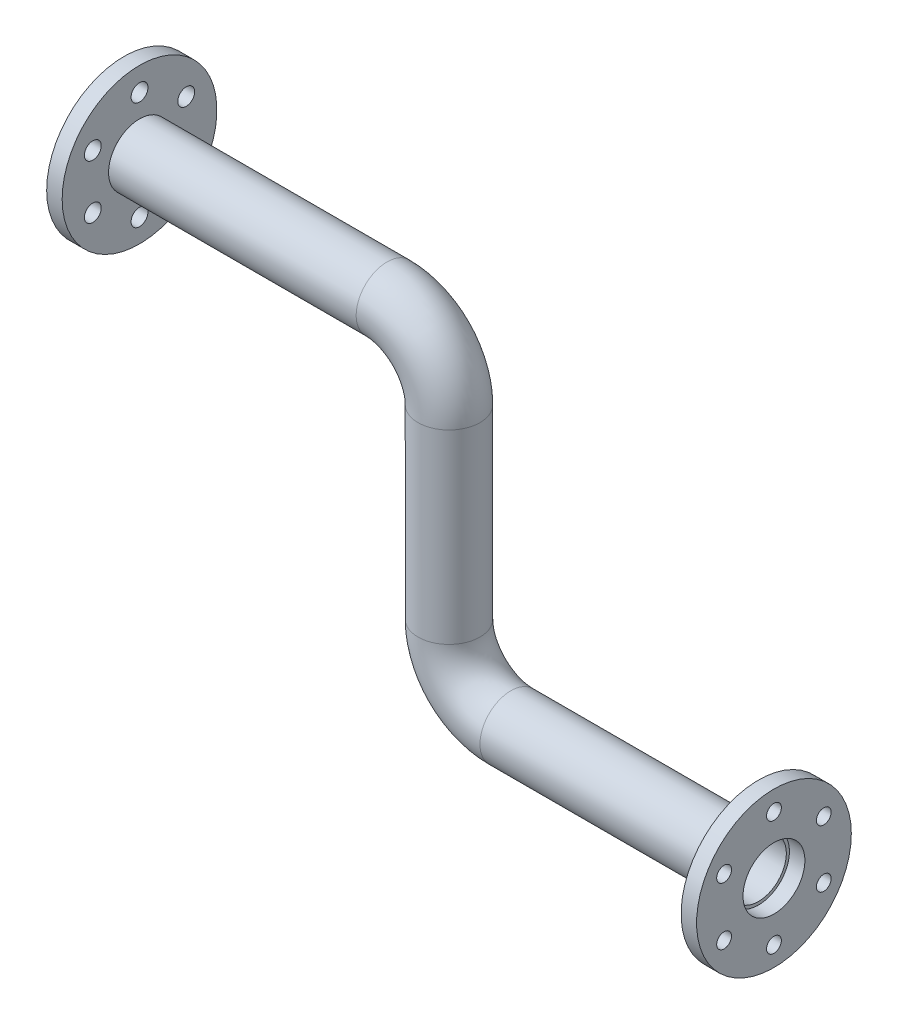
ISO-10303-21;
HEADER;
FILE_DESCRIPTION(('STEP AP214'),'2;1');
FILE_NAME('part.step','',(''),(''),'','','');
FILE_SCHEMA(('AUTOMOTIVE_DESIGN { 1 0 10303 214 1 1 1 1 }'));
ENDSEC;
DATA;
#1=APPLICATION_CONTEXT('core data for automotive mechanical design processes');
#2=APPLICATION_PROTOCOL_DEFINITION('international standard','automotive_design',2000,#1);
#3=PRODUCT_CONTEXT('',#1,'mechanical');
#4=PRODUCT('Part','Part','',(#3));
#5=PRODUCT_RELATED_PRODUCT_CATEGORY('part','',(#4));
#6=PRODUCT_DEFINITION_FORMATION('','',#4);
#7=PRODUCT_DEFINITION_CONTEXT('part definition',#1,'design');
#8=PRODUCT_DEFINITION('design','',#6,#7);
#9=PRODUCT_DEFINITION_SHAPE('','',#8);
#10=(LENGTH_UNIT() NAMED_UNIT(*) SI_UNIT(.MILLI.,.METRE.));
#11=(NAMED_UNIT(*) PLANE_ANGLE_UNIT() SI_UNIT($,.RADIAN.));
#12=(NAMED_UNIT(*) SI_UNIT($,.STERADIAN.) SOLID_ANGLE_UNIT());
#13=UNCERTAINTY_MEASURE_WITH_UNIT(LENGTH_MEASURE(1.E-05),#10,'distance_accuracy_value','');
#14=(GEOMETRIC_REPRESENTATION_CONTEXT(3) GLOBAL_UNCERTAINTY_ASSIGNED_CONTEXT((#13)) GLOBAL_UNIT_ASSIGNED_CONTEXT((#10,
#11,#12)) REPRESENTATION_CONTEXT('',''));
#15=CARTESIAN_POINT('',(0.,0.,0.));
#16=DIRECTION('',(0.,0.,1.));
#17=DIRECTION('',(1.,0.,0.));
#18=AXIS2_PLACEMENT_3D('',#15,#16,#17);
#19=CARTESIAN_POINT('',(205.,-100.000000000002,0.));
#20=DIRECTION('',(1.,0.,0.));
#21=DIRECTION('',(0.,0.,-1.));
#22=AXIS2_PLACEMENT_3D('',#19,#20,#21);
#23=PLANE('',#22);
#24=CARTESIAN_POINT('',(205.,-90.7015929837478,-16.105313381606));
#25=DIRECTION('',(1.,0.,0.));
#26=DIRECTION('',(0.,-0.866025403784433,-0.50000000000001));
#27=AXIS2_PLACEMENT_3D('',#24,#25,#26);
#28=CIRCLE('',#27,2.39409198799303);
#29=CARTESIAN_POINT('',(205.,-92.7749374643465,-17.3023593756026));
#30=VERTEX_POINT('',#29);
#31=EDGE_CURVE('E107',#30,#30,#28,.T.);
#32=ORIENTED_EDGE('',*,*,#31,.F.);
#33=EDGE_LOOP('',(#32));
#34=FACE_BOUND('',#33,.T.);
#35=CARTESIAN_POINT('',(205.,-109.298407016255,-16.1053133816062));
#36=DIRECTION('',(1.,0.,0.));
#37=DIRECTION('',(0.,-0.866025403784443,0.499999999999992));
#38=AXIS2_PLACEMENT_3D('',#35,#36,#37);
#39=CIRCLE('',#38,2.39409198799303);
#40=CARTESIAN_POINT('',(205.,-111.371751496854,-14.9082673876097));
#41=VERTEX_POINT('',#40);
#42=EDGE_CURVE('E106',#41,#41,#39,.T.);
#43=ORIENTED_EDGE('',*,*,#42,.F.);
#44=EDGE_LOOP('',(#43));
#45=FACE_BOUND('',#44,.T.);
#46=CARTESIAN_POINT('',(205.,-118.596814032509,0.));
#47=DIRECTION('',(1.,0.,0.));
#48=DIRECTION('',(0.,0.,1.));
#49=AXIS2_PLACEMENT_3D('',#46,#47,#48);
#50=CIRCLE('',#49,2.39409198799303);
#51=CARTESIAN_POINT('',(205.,-118.596814032509,2.39409198799303));
#52=VERTEX_POINT('',#51);
#53=EDGE_CURVE('E113',#52,#52,#50,.T.);
#54=ORIENTED_EDGE('',*,*,#53,.F.);
#55=EDGE_LOOP('',(#54));
#56=FACE_BOUND('',#55,.T.);
#57=CARTESIAN_POINT('',(205.,-109.298407016255,16.1053133816061));
#58=DIRECTION('',(1.,0.,0.));
#59=DIRECTION('',(0.,0.866025403784436,0.500000000000004));
#60=AXIS2_PLACEMENT_3D('',#57,#58,#59);
#61=CIRCLE('',#60,2.39409198799303);
#62=CARTESIAN_POINT('',(205.,-107.225062535656,17.3023593756026));
#63=VERTEX_POINT('',#62);
#64=EDGE_CURVE('E119',#63,#63,#61,.T.);
#65=ORIENTED_EDGE('',*,*,#64,.F.);
#66=EDGE_LOOP('',(#65));
#67=FACE_BOUND('',#66,.T.);
#68=CARTESIAN_POINT('',(205.,-90.701592983748,16.1053133816062));
#69=DIRECTION('',(1.,0.,0.));
#70=DIRECTION('',(0.,0.86602540378444,-0.499999999999998));
#71=AXIS2_PLACEMENT_3D('',#68,#69,#70);
#72=CIRCLE('',#71,2.39409198799303);
#73=CARTESIAN_POINT('',(205.,-88.6282485031492,14.9082673876096));
#74=VERTEX_POINT('',#73);
#75=EDGE_CURVE('E99',#74,#74,#72,.T.);
#76=ORIENTED_EDGE('',*,*,#75,.F.);
#77=EDGE_LOOP('',(#76));
#78=FACE_BOUND('',#77,.T.);
#79=CARTESIAN_POINT('',(205.,-81.4031859674944,0.));
#80=DIRECTION('',(1.,0.,0.));
#81=DIRECTION('',(0.,0.,-1.));
#82=AXIS2_PLACEMENT_3D('',#79,#80,#81);
#83=CIRCLE('',#82,2.39409198799303);
#84=CARTESIAN_POINT('',(205.,-81.4031859674944,-2.39409198799303));
#85=VERTEX_POINT('',#84);
#86=EDGE_CURVE('E93',#85,#85,#83,.T.);
#87=ORIENTED_EDGE('',*,*,#86,.F.);
#88=EDGE_LOOP('',(#87));
#89=FACE_BOUND('',#88,.T.);
#90=CARTESIAN_POINT('',(205.,-100.000000000002,0.));
#91=DIRECTION('',(1.,0.,0.));
#92=DIRECTION('',(0.,0.,-1.));
#93=AXIS2_PLACEMENT_3D('',#90,#91,#92);
#94=CIRCLE('',#93,25.);
#95=CARTESIAN_POINT('',(205.,-100.000000000002,-25.));
#96=VERTEX_POINT('',#95);
#97=EDGE_CURVE('E12',#96,#96,#94,.T.);
#98=ORIENTED_EDGE('',*,*,#97,.T.);
#99=EDGE_LOOP('',(#98));
#100=FACE_BOUND('',#99,.T.);
#101=CARTESIAN_POINT('',(205.,-100.,0.));
#102=DIRECTION('',(1.,0.,0.));
#103=DIRECTION('',(0.,0.,-1.));
#104=AXIS2_PLACEMENT_3D('',#101,#102,#103);
#105=CIRCLE('',#104,10.);
#106=CARTESIAN_POINT('',(205.,-100.,-10.));
#107=VERTEX_POINT('',#106);
#108=EDGE_CURVE('E83',#107,#107,#105,.T.);
#109=ORIENTED_EDGE('',*,*,#108,.F.);
#110=EDGE_LOOP('',(#109));
#111=FACE_BOUND('',#110,.T.);
#112=ADVANCED_FACE('F72',(#34,#45,#56,#67,#78,#89,#100,#111),#23,.T.);
#113=CARTESIAN_POINT('',(200.,-100.000000000002,0.));
#114=DIRECTION('',(1.,0.,0.));
#115=DIRECTION('',(0.,0.,-1.));
#116=AXIS2_PLACEMENT_3D('',#113,#114,#115);
#117=PLANE('',#116);
#118=CARTESIAN_POINT('',(200.,-90.7015929837478,-16.105313381606));
#119=DIRECTION('',(1.,0.,0.));
#120=DIRECTION('',(0.,0.,-1.));
#121=AXIS2_PLACEMENT_3D('',#118,#119,#120);
#122=CIRCLE('',#121,2.39409198799303);
#123=CARTESIAN_POINT('',(200.,-90.7015929837478,-18.4994053695991));
#124=VERTEX_POINT('',#123);
#125=EDGE_CURVE('E103',#124,#124,#122,.F.);
#126=ORIENTED_EDGE('',*,*,#125,.F.);
#127=EDGE_LOOP('',(#126));
#128=FACE_BOUND('',#127,.T.);
#129=CARTESIAN_POINT('',(200.,-109.298407016255,-16.1053133816062));
#130=DIRECTION('',(1.,0.,0.));
#131=DIRECTION('',(0.,0.,-1.));
#132=AXIS2_PLACEMENT_3D('',#129,#130,#131);
#133=CIRCLE('',#132,2.39409198799303);
#134=CARTESIAN_POINT('',(200.,-109.298407016255,-18.4994053695993));
#135=VERTEX_POINT('',#134);
#136=EDGE_CURVE('E110',#135,#135,#133,.F.);
#137=ORIENTED_EDGE('',*,*,#136,.F.);
#138=EDGE_LOOP('',(#137));
#139=FACE_BOUND('',#138,.T.);
#140=CARTESIAN_POINT('',(200.,-118.596814032509,0.));
#141=DIRECTION('',(1.,0.,0.));
#142=DIRECTION('',(0.,0.,-1.));
#143=AXIS2_PLACEMENT_3D('',#140,#141,#142);
#144=CIRCLE('',#143,2.39409198799303);
#145=CARTESIAN_POINT('',(200.,-118.596814032509,-2.39409198799303));
#146=VERTEX_POINT('',#145);
#147=EDGE_CURVE('E116',#146,#146,#144,.F.);
#148=ORIENTED_EDGE('',*,*,#147,.F.);
#149=EDGE_LOOP('',(#148));
#150=FACE_BOUND('',#149,.T.);
#151=CARTESIAN_POINT('',(200.,-109.298407016255,16.1053133816061));
#152=DIRECTION('',(1.,0.,0.));
#153=DIRECTION('',(0.,0.,-1.));
#154=AXIS2_PLACEMENT_3D('',#151,#152,#153);
#155=CIRCLE('',#154,2.39409198799303);
#156=CARTESIAN_POINT('',(200.,-109.298407016255,13.7112213936131));
#157=VERTEX_POINT('',#156);
#158=EDGE_CURVE('E102',#157,#157,#155,.F.);
#159=ORIENTED_EDGE('',*,*,#158,.F.);
#160=EDGE_LOOP('',(#159));
#161=FACE_BOUND('',#160,.T.);
#162=CARTESIAN_POINT('',(200.,-90.701592983748,16.1053133816062));
#163=DIRECTION('',(1.,0.,0.));
#164=DIRECTION('',(0.,0.,-1.));
#165=AXIS2_PLACEMENT_3D('',#162,#163,#164);
#166=CIRCLE('',#165,2.39409198799303);
#167=CARTESIAN_POINT('',(200.,-90.701592983748,13.7112213936131));
#168=VERTEX_POINT('',#167);
#169=EDGE_CURVE('E96',#168,#168,#166,.F.);
#170=ORIENTED_EDGE('',*,*,#169,.F.);
#171=EDGE_LOOP('',(#170));
#172=FACE_BOUND('',#171,.T.);
#173=CARTESIAN_POINT('',(200.,-81.4031859674944,0.));
#174=DIRECTION('',(1.,0.,0.));
#175=DIRECTION('',(0.,0.,-1.));
#176=AXIS2_PLACEMENT_3D('',#173,#174,#175);
#177=CIRCLE('',#176,2.39409198799303);
#178=CARTESIAN_POINT('',(200.,-81.4031859674944,-2.39409198799303));
#179=VERTEX_POINT('',#178);
#180=EDGE_CURVE('E88',#179,#179,#177,.F.);
#181=ORIENTED_EDGE('',*,*,#180,.F.);
#182=EDGE_LOOP('',(#181));
#183=FACE_BOUND('',#182,.T.);
#184=CARTESIAN_POINT('',(200.,-100.000000000002,0.));
#185=DIRECTION('',(1.,0.,0.));
#186=DIRECTION('',(0.,0.,-1.));
#187=AXIS2_PLACEMENT_3D('',#184,#185,#186);
#188=CIRCLE('',#187,25.);
#189=CARTESIAN_POINT('',(200.,-100.000000000002,-25.));
#190=VERTEX_POINT('',#189);
#191=EDGE_CURVE('E76',#190,#190,#188,.T.);
#192=ORIENTED_EDGE('',*,*,#191,.F.);
#193=EDGE_LOOP('',(#192));
#194=FACE_BOUND('',#193,.T.);
#195=CARTESIAN_POINT('',(200.,-100.,0.));
#196=DIRECTION('',(1.,0.,0.));
#197=DIRECTION('',(0.,0.,-1.));
#198=AXIS2_PLACEMENT_3D('',#195,#196,#197);
#199=CIRCLE('',#198,10.);
#200=CARTESIAN_POINT('',(200.,-100.,-10.));
#201=VERTEX_POINT('',#200);
#202=EDGE_CURVE('E85',#201,#201,#199,.T.);
#203=ORIENTED_EDGE('',*,*,#202,.T.);
#204=EDGE_LOOP('',(#203));
#205=FACE_BOUND('',#204,.T.);
#206=ADVANCED_FACE('F132',(#128,#139,#150,#161,#172,#183,#194,#205),#117,.F.);
#207=CARTESIAN_POINT('',(205.,-100.000000000002,0.));
#208=DIRECTION('',(-1.,0.,0.));
#209=DIRECTION('',(0.,0.,1.));
#210=AXIS2_PLACEMENT_3D('',#207,#208,#209);
#211=CYLINDRICAL_SURFACE('',#210,25.);
#212=ORIENTED_EDGE('',*,*,#97,.F.);
#213=EDGE_LOOP('',(#212));
#214=FACE_BOUND('',#213,.T.);
#215=ORIENTED_EDGE('',*,*,#191,.T.);
#216=EDGE_LOOP('',(#215));
#217=FACE_BOUND('',#216,.T.);
#218=ADVANCED_FACE('F74',(#214,#217),#211,.T.);
#219=CARTESIAN_POINT('',(205.,-100.,0.));
#220=DIRECTION('',(-1.,0.,0.));
#221=DIRECTION('',(0.,0.,1.));
#222=AXIS2_PLACEMENT_3D('',#219,#220,#221);
#223=CYLINDRICAL_SURFACE('',#222,10.);
#224=ORIENTED_EDGE('',*,*,#108,.T.);
#225=EDGE_LOOP('',(#224));
#226=FACE_BOUND('',#225,.T.);
#227=ORIENTED_EDGE('',*,*,#202,.F.);
#228=EDGE_LOOP('',(#227));
#229=FACE_BOUND('',#228,.T.);
#230=ADVANCED_FACE('F141',(#226,#229),#223,.F.);
#231=CARTESIAN_POINT('',(-5.00100000000001,-81.4031859674944,0.));
#232=DIRECTION('',(1.,0.,0.));
#233=DIRECTION('',(0.,0.,-1.));
#234=AXIS2_PLACEMENT_3D('',#231,#232,#233);
#235=CYLINDRICAL_SURFACE('',#234,2.39409198799303);
#236=ORIENTED_EDGE('',*,*,#86,.T.);
#237=EDGE_LOOP('',(#236));
#238=FACE_BOUND('',#237,.T.);
#239=ORIENTED_EDGE('',*,*,#180,.T.);
#240=EDGE_LOOP('',(#239));
#241=FACE_BOUND('',#240,.T.);
#242=ADVANCED_FACE('F144',(#238,#241),#235,.F.);
#243=CARTESIAN_POINT('',(199.999,-90.701592983748,16.1053133816062));
#244=DIRECTION('',(1.,0.,0.));
#245=DIRECTION('',(0.,0.,-1.));
#246=AXIS2_PLACEMENT_3D('',#243,#244,#245);
#247=CYLINDRICAL_SURFACE('',#246,2.39409198799303);
#248=ORIENTED_EDGE('',*,*,#75,.T.);
#249=EDGE_LOOP('',(#248));
#250=FACE_BOUND('',#249,.T.);
#251=ORIENTED_EDGE('',*,*,#169,.T.);
#252=EDGE_LOOP('',(#251));
#253=FACE_BOUND('',#252,.T.);
#254=ADVANCED_FACE('F159',(#250,#253),#247,.F.);
#255=CARTESIAN_POINT('',(199.999,-109.298407016255,16.1053133816061));
#256=DIRECTION('',(1.,0.,0.));
#257=DIRECTION('',(0.,0.,-1.));
#258=AXIS2_PLACEMENT_3D('',#255,#256,#257);
#259=CYLINDRICAL_SURFACE('',#258,2.39409198799303);
#260=ORIENTED_EDGE('',*,*,#64,.T.);
#261=EDGE_LOOP('',(#260));
#262=FACE_BOUND('',#261,.T.);
#263=ORIENTED_EDGE('',*,*,#158,.T.);
#264=EDGE_LOOP('',(#263));
#265=FACE_BOUND('',#264,.T.);
#266=ADVANCED_FACE('F127',(#262,#265),#259,.F.);
#267=CARTESIAN_POINT('',(199.999,-118.596814032509,0.));
#268=DIRECTION('',(1.,0.,0.));
#269=DIRECTION('',(0.,0.,-1.));
#270=AXIS2_PLACEMENT_3D('',#267,#268,#269);
#271=CYLINDRICAL_SURFACE('',#270,2.39409198799303);
#272=ORIENTED_EDGE('',*,*,#53,.T.);
#273=EDGE_LOOP('',(#272));
#274=FACE_BOUND('',#273,.T.);
#275=ORIENTED_EDGE('',*,*,#147,.T.);
#276=EDGE_LOOP('',(#275));
#277=FACE_BOUND('',#276,.T.);
#278=ADVANCED_FACE('F171',(#274,#277),#271,.F.);
#279=CARTESIAN_POINT('',(199.999,-109.298407016255,-16.1053133816062));
#280=DIRECTION('',(1.,0.,0.));
#281=DIRECTION('',(0.,0.,-1.));
#282=AXIS2_PLACEMENT_3D('',#279,#280,#281);
#283=CYLINDRICAL_SURFACE('',#282,2.39409198799303);
#284=ORIENTED_EDGE('',*,*,#42,.T.);
#285=EDGE_LOOP('',(#284));
#286=FACE_BOUND('',#285,.T.);
#287=ORIENTED_EDGE('',*,*,#136,.T.);
#288=EDGE_LOOP('',(#287));
#289=FACE_BOUND('',#288,.T.);
#290=ADVANCED_FACE('F167',(#286,#289),#283,.F.);
#291=CARTESIAN_POINT('',(199.999,-90.7015929837478,-16.105313381606));
#292=DIRECTION('',(1.,0.,0.));
#293=DIRECTION('',(0.,0.,-1.));
#294=AXIS2_PLACEMENT_3D('',#291,#292,#293);
#295=CYLINDRICAL_SURFACE('',#294,2.39409198799303);
#296=ORIENTED_EDGE('',*,*,#31,.T.);
#297=EDGE_LOOP('',(#296));
#298=FACE_BOUND('',#297,.T.);
#299=ORIENTED_EDGE('',*,*,#125,.T.);
#300=EDGE_LOOP('',(#299));
#301=FACE_BOUND('',#300,.T.);
#302=ADVANCED_FACE('F164',(#298,#301),#295,.F.);
#303=CLOSED_SHELL('',(#112,#206,#218,#230,#242,#254,#266,#278,#290,#302));
#304=MANIFOLD_SOLID_BREP('B2',#303);
#305=CARTESIAN_POINT('',(-5.,0.,0.));
#306=DIRECTION('',(-1.,0.,0.));
#307=DIRECTION('',(0.,0.,1.));
#308=AXIS2_PLACEMENT_3D('',#305,#306,#307);
#309=PLANE('',#308);
#310=CARTESIAN_POINT('',(-5.,8.71103267016308,15.0879511711144));
#311=DIRECTION('',(-1.,0.,0.));
#312=DIRECTION('',(0.,-0.866025403784433,0.50000000000001));
#313=AXIS2_PLACEMENT_3D('',#310,#311,#312);
#314=CIRCLE('',#313,2.72504603576209);
#315=CARTESIAN_POINT('',(-5.,6.35107357671105,16.4504741889955));
#316=VERTEX_POINT('',#315);
#317=EDGE_CURVE('E298',#316,#316,#314,.T.);
#318=ORIENTED_EDGE('',*,*,#317,.F.);
#319=EDGE_LOOP('',(#318));
#320=FACE_BOUND('',#319,.T.);
#321=CARTESIAN_POINT('',(-5.,-8.71103267016277,15.0879511711146));
#322=DIRECTION('',(-1.,0.,0.));
#323=DIRECTION('',(0.,-0.866025403784443,-0.499999999999992));
#324=AXIS2_PLACEMENT_3D('',#321,#322,#323);
#325=CIRCLE('',#324,2.72504603576209);
#326=CARTESIAN_POINT('',(-5.,-11.0709917636148,13.7254281532336));
#327=VERTEX_POINT('',#326);
#328=EDGE_CURVE('E304',#327,#327,#325,.T.);
#329=ORIENTED_EDGE('',*,*,#328,.F.);
#330=EDGE_LOOP('',(#329));
#331=FACE_BOUND('',#330,.T.);
#332=CARTESIAN_POINT('',(-5.,-17.4220653403258,0.));
#333=DIRECTION('',(-1.,0.,0.));
#334=DIRECTION('',(0.,0.,-1.));
#335=AXIS2_PLACEMENT_3D('',#332,#333,#334);
#336=CIRCLE('',#335,2.72504603576209);
#337=CARTESIAN_POINT('',(-5.,-17.4220653403258,-2.72504603576209));
#338=VERTEX_POINT('',#337);
#339=EDGE_CURVE('E310',#338,#338,#336,.T.);
#340=ORIENTED_EDGE('',*,*,#339,.F.);
#341=EDGE_LOOP('',(#340));
#342=FACE_BOUND('',#341,.T.);
#343=CARTESIAN_POINT('',(-5.,-8.71103267016298,-15.0879511711145));
#344=DIRECTION('',(-1.,0.,0.));
#345=DIRECTION('',(0.,0.866025403784436,-0.500000000000004));
#346=AXIS2_PLACEMENT_3D('',#343,#344,#345);
#347=CIRCLE('',#346,2.72504603576209);
#348=CARTESIAN_POINT('',(-5.,-6.35107357671093,-16.4504741889956));
#349=VERTEX_POINT('',#348);
#350=EDGE_CURVE('E316',#349,#349,#347,.T.);
#351=ORIENTED_EDGE('',*,*,#350,.F.);
#352=EDGE_LOOP('',(#351));
#353=FACE_BOUND('',#352,.T.);
#354=CARTESIAN_POINT('',(-5.,8.71103267016287,-15.0879511711146));
#355=DIRECTION('',(-1.,0.,0.));
#356=DIRECTION('',(0.,0.86602540378444,0.499999999999998));
#357=AXIS2_PLACEMENT_3D('',#354,#355,#356);
#358=CIRCLE('',#357,2.72504603576209);
#359=CARTESIAN_POINT('',(-5.,11.0709917636149,-13.7254281532335));
#360=VERTEX_POINT('',#359);
#361=EDGE_CURVE('E292',#360,#360,#358,.T.);
#362=ORIENTED_EDGE('',*,*,#361,.F.);
#363=EDGE_LOOP('',(#362));
#364=FACE_BOUND('',#363,.T.);
#365=CARTESIAN_POINT('',(-5.,17.4220653403258,0.));
#366=DIRECTION('',(-1.,0.,0.));
#367=DIRECTION('',(0.,0.,1.));
#368=AXIS2_PLACEMENT_3D('',#365,#366,#367);
#369=CIRCLE('',#368,2.72504603576209);
#370=CARTESIAN_POINT('',(-5.,17.4220653403258,2.72504603576209));
#371=VERTEX_POINT('',#370);
#372=EDGE_CURVE('E286',#371,#371,#369,.T.);
#373=ORIENTED_EDGE('',*,*,#372,.F.);
#374=EDGE_LOOP('',(#373));
#375=FACE_BOUND('',#374,.T.);
#376=CARTESIAN_POINT('',(-5.,0.,0.));
#377=DIRECTION('',(-1.,0.,0.));
#378=DIRECTION('',(0.,0.,1.));
#379=AXIS2_PLACEMENT_3D('',#376,#377,#378);
#380=CIRCLE('',#379,25.);
#381=CARTESIAN_POINT('',(-5.,0.,25.));
#382=VERTEX_POINT('',#381);
#383=EDGE_CURVE('E71',#382,#382,#380,.T.);
#384=ORIENTED_EDGE('',*,*,#383,.T.);
#385=EDGE_LOOP('',(#384));
#386=FACE_BOUND('',#385,.T.);
#387=CARTESIAN_POINT('',(-5.,0.,0.));
#388=DIRECTION('',(-1.,0.,0.));
#389=DIRECTION('',(0.,0.,1.));
#390=AXIS2_PLACEMENT_3D('',#387,#388,#389);
#391=CIRCLE('',#390,10.);
#392=CARTESIAN_POINT('',(-5.,0.,10.));
#393=VERTEX_POINT('',#392);
#394=EDGE_CURVE('E278',#393,#393,#391,.T.);
#395=ORIENTED_EDGE('',*,*,#394,.F.);
#396=EDGE_LOOP('',(#395));
#397=FACE_BOUND('',#396,.T.);
#398=ADVANCED_FACE('F267',(#320,#331,#342,#353,#364,#375,#386,#397),#309,.T.);
#399=CARTESIAN_POINT('',(0.,0.,0.));
#400=DIRECTION('',(-1.,0.,0.));
#401=DIRECTION('',(0.,0.,1.));
#402=AXIS2_PLACEMENT_3D('',#399,#400,#401);
#403=PLANE('',#402);
#404=CARTESIAN_POINT('',(0.,8.71103267016308,15.0879511711144));
#405=DIRECTION('',(-1.,0.,0.));
#406=DIRECTION('',(0.,-0.866025403784433,0.50000000000001));
#407=AXIS2_PLACEMENT_3D('',#404,#405,#406);
#408=CIRCLE('',#407,2.72504603576209);
#409=CARTESIAN_POINT('',(0.,6.35107357671105,16.4504741889955));
#410=VERTEX_POINT('',#409);
#411=EDGE_CURVE('E301',#410,#410,#408,.T.);
#412=ORIENTED_EDGE('',*,*,#411,.T.);
#413=EDGE_LOOP('',(#412));
#414=FACE_BOUND('',#413,.T.);
#415=CARTESIAN_POINT('',(0.,-8.71103267016277,15.0879511711146));
#416=DIRECTION('',(-1.,0.,0.));
#417=DIRECTION('',(0.,-0.866025403784443,-0.499999999999992));
#418=AXIS2_PLACEMENT_3D('',#415,#416,#417);
#419=CIRCLE('',#418,2.72504603576209);
#420=CARTESIAN_POINT('',(0.,-11.0709917636148,13.7254281532336));
#421=VERTEX_POINT('',#420);
#422=EDGE_CURVE('E307',#421,#421,#419,.T.);
#423=ORIENTED_EDGE('',*,*,#422,.T.);
#424=EDGE_LOOP('',(#423));
#425=FACE_BOUND('',#424,.T.);
#426=CARTESIAN_POINT('',(0.,-17.4220653403258,0.));
#427=DIRECTION('',(-1.,0.,0.));
#428=DIRECTION('',(0.,0.,-1.));
#429=AXIS2_PLACEMENT_3D('',#426,#427,#428);
#430=CIRCLE('',#429,2.72504603576209);
#431=CARTESIAN_POINT('',(0.,-17.4220653403258,-2.72504603576209));
#432=VERTEX_POINT('',#431);
#433=EDGE_CURVE('E313',#432,#432,#430,.T.);
#434=ORIENTED_EDGE('',*,*,#433,.T.);
#435=EDGE_LOOP('',(#434));
#436=FACE_BOUND('',#435,.T.);
#437=CARTESIAN_POINT('',(0.,-8.71103267016298,-15.0879511711145));
#438=DIRECTION('',(-1.,0.,0.));
#439=DIRECTION('',(0.,0.866025403784436,-0.500000000000004));
#440=AXIS2_PLACEMENT_3D('',#437,#438,#439);
#441=CIRCLE('',#440,2.72504603576209);
#442=CARTESIAN_POINT('',(0.,-6.35107357671093,-16.4504741889956));
#443=VERTEX_POINT('',#442);
#444=EDGE_CURVE('E295',#443,#443,#441,.T.);
#445=ORIENTED_EDGE('',*,*,#444,.T.);
#446=EDGE_LOOP('',(#445));
#447=FACE_BOUND('',#446,.T.);
#448=CARTESIAN_POINT('',(0.,8.71103267016287,-15.0879511711146));
#449=DIRECTION('',(-1.,0.,0.));
#450=DIRECTION('',(0.,0.86602540378444,0.499999999999998));
#451=AXIS2_PLACEMENT_3D('',#448,#449,#450);
#452=CIRCLE('',#451,2.72504603576209);
#453=CARTESIAN_POINT('',(0.,11.0709917636149,-13.7254281532335));
#454=VERTEX_POINT('',#453);
#455=EDGE_CURVE('E289',#454,#454,#452,.T.);
#456=ORIENTED_EDGE('',*,*,#455,.T.);
#457=EDGE_LOOP('',(#456));
#458=FACE_BOUND('',#457,.T.);
#459=CARTESIAN_POINT('',(0.,17.4220653403258,0.));
#460=DIRECTION('',(-1.,0.,0.));
#461=DIRECTION('',(0.,0.,1.));
#462=AXIS2_PLACEMENT_3D('',#459,#460,#461);
#463=CIRCLE('',#462,2.72504603576209);
#464=CARTESIAN_POINT('',(0.,17.4220653403258,2.72504603576209));
#465=VERTEX_POINT('',#464);
#466=EDGE_CURVE('E283',#465,#465,#463,.T.);
#467=ORIENTED_EDGE('',*,*,#466,.T.);
#468=EDGE_LOOP('',(#467));
#469=FACE_BOUND('',#468,.T.);
#470=CARTESIAN_POINT('',(0.,0.,0.));
#471=DIRECTION('',(-1.,0.,0.));
#472=DIRECTION('',(0.,0.,1.));
#473=AXIS2_PLACEMENT_3D('',#470,#471,#472);
#474=CIRCLE('',#473,25.);
#475=CARTESIAN_POINT('',(0.,0.,25.));
#476=VERTEX_POINT('',#475);
#477=EDGE_CURVE('E271',#476,#476,#474,.T.);
#478=ORIENTED_EDGE('',*,*,#477,.F.);
#479=EDGE_LOOP('',(#478));
#480=FACE_BOUND('',#479,.T.);
#481=CARTESIAN_POINT('',(0.,0.,0.));
#482=DIRECTION('',(-1.,0.,0.));
#483=DIRECTION('',(0.,0.,1.));
#484=AXIS2_PLACEMENT_3D('',#481,#482,#483);
#485=CIRCLE('',#484,10.);
#486=CARTESIAN_POINT('',(0.,0.,10.));
#487=VERTEX_POINT('',#486);
#488=EDGE_CURVE('E280',#487,#487,#485,.T.);
#489=ORIENTED_EDGE('',*,*,#488,.T.);
#490=EDGE_LOOP('',(#489));
#491=FACE_BOUND('',#490,.T.);
#492=ADVANCED_FACE('F322',(#414,#425,#436,#447,#458,#469,#480,#491),#403,.F.);
#493=CARTESIAN_POINT('',(-5.,0.,0.));
#494=DIRECTION('',(1.,0.,0.));
#495=DIRECTION('',(0.,0.,-1.));
#496=AXIS2_PLACEMENT_3D('',#493,#494,#495);
#497=CYLINDRICAL_SURFACE('',#496,25.);
#498=ORIENTED_EDGE('',*,*,#383,.F.);
#499=EDGE_LOOP('',(#498));
#500=FACE_BOUND('',#499,.T.);
#501=ORIENTED_EDGE('',*,*,#477,.T.);
#502=EDGE_LOOP('',(#501));
#503=FACE_BOUND('',#502,.T.);
#504=ADVANCED_FACE('F269',(#500,#503),#497,.T.);
#505=CARTESIAN_POINT('',(-5.,0.,0.));
#506=DIRECTION('',(1.,0.,0.));
#507=DIRECTION('',(0.,0.,-1.));
#508=AXIS2_PLACEMENT_3D('',#505,#506,#507);
#509=CYLINDRICAL_SURFACE('',#508,10.);
#510=ORIENTED_EDGE('',*,*,#394,.T.);
#511=EDGE_LOOP('',(#510));
#512=FACE_BOUND('',#511,.T.);
#513=ORIENTED_EDGE('',*,*,#488,.F.);
#514=EDGE_LOOP('',(#513));
#515=FACE_BOUND('',#514,.T.);
#516=ADVANCED_FACE('F343',(#512,#515),#509,.F.);
#517=CARTESIAN_POINT('',(0.,17.4220653403258,0.));
#518=DIRECTION('',(-1.,0.,0.));
#519=DIRECTION('',(0.,0.,1.));
#520=AXIS2_PLACEMENT_3D('',#517,#518,#519);
#521=CYLINDRICAL_SURFACE('',#520,2.72504603576209);
#522=ORIENTED_EDGE('',*,*,#466,.F.);
#523=EDGE_LOOP('',(#522));
#524=FACE_BOUND('',#523,.T.);
#525=ORIENTED_EDGE('',*,*,#372,.T.);
#526=EDGE_LOOP('',(#525));
#527=FACE_BOUND('',#526,.T.);
#528=ADVANCED_FACE('F346',(#524,#527),#521,.F.);
#529=CARTESIAN_POINT('',(0.,8.71103267016287,-15.0879511711146));
#530=DIRECTION('',(-1.,0.,0.));
#531=DIRECTION('',(0.,0.,1.));
#532=AXIS2_PLACEMENT_3D('',#529,#530,#531);
#533=CYLINDRICAL_SURFACE('',#532,2.72504603576209);
#534=ORIENTED_EDGE('',*,*,#455,.F.);
#535=EDGE_LOOP('',(#534));
#536=FACE_BOUND('',#535,.T.);
#537=ORIENTED_EDGE('',*,*,#361,.T.);
#538=EDGE_LOOP('',(#537));
#539=FACE_BOUND('',#538,.T.);
#540=ADVANCED_FACE('F329',(#536,#539),#533,.F.);
#541=CARTESIAN_POINT('',(0.,-8.71103267016298,-15.0879511711145));
#542=DIRECTION('',(-1.,0.,0.));
#543=DIRECTION('',(0.,0.,1.));
#544=AXIS2_PLACEMENT_3D('',#541,#542,#543);
#545=CYLINDRICAL_SURFACE('',#544,2.72504603576209);
#546=ORIENTED_EDGE('',*,*,#444,.F.);
#547=EDGE_LOOP('',(#546));
#548=FACE_BOUND('',#547,.T.);
#549=ORIENTED_EDGE('',*,*,#350,.T.);
#550=EDGE_LOOP('',(#549));
#551=FACE_BOUND('',#550,.T.);
#552=ADVANCED_FACE('F325',(#548,#551),#545,.F.);
#553=CARTESIAN_POINT('',(0.,-17.4220653403258,0.));
#554=DIRECTION('',(-1.,0.,0.));
#555=DIRECTION('',(0.,0.,1.));
#556=AXIS2_PLACEMENT_3D('',#553,#554,#555);
#557=CYLINDRICAL_SURFACE('',#556,2.72504603576209);
#558=ORIENTED_EDGE('',*,*,#433,.F.);
#559=EDGE_LOOP('',(#558));
#560=FACE_BOUND('',#559,.T.);
#561=ORIENTED_EDGE('',*,*,#339,.T.);
#562=EDGE_LOOP('',(#561));
#563=FACE_BOUND('',#562,.T.);
#564=ADVANCED_FACE('F328',(#560,#563),#557,.F.);
#565=CARTESIAN_POINT('',(0.,-8.71103267016277,15.0879511711146));
#566=DIRECTION('',(-1.,0.,0.));
#567=DIRECTION('',(0.,0.,1.));
#568=AXIS2_PLACEMENT_3D('',#565,#566,#567);
#569=CYLINDRICAL_SURFACE('',#568,2.72504603576209);
#570=ORIENTED_EDGE('',*,*,#422,.F.);
#571=EDGE_LOOP('',(#570));
#572=FACE_BOUND('',#571,.T.);
#573=ORIENTED_EDGE('',*,*,#328,.T.);
#574=EDGE_LOOP('',(#573));
#575=FACE_BOUND('',#574,.T.);
#576=ADVANCED_FACE('F367',(#572,#575),#569,.F.);
#577=CARTESIAN_POINT('',(0.,8.71103267016308,15.0879511711144));
#578=DIRECTION('',(-1.,0.,0.));
#579=DIRECTION('',(0.,0.,1.));
#580=AXIS2_PLACEMENT_3D('',#577,#578,#579);
#581=CYLINDRICAL_SURFACE('',#580,2.72504603576209);
#582=ORIENTED_EDGE('',*,*,#411,.F.);
#583=EDGE_LOOP('',(#582));
#584=FACE_BOUND('',#583,.T.);
#585=ORIENTED_EDGE('',*,*,#317,.T.);
#586=EDGE_LOOP('',(#585));
#587=FACE_BOUND('',#586,.T.);
#588=ADVANCED_FACE('F364',(#584,#587),#581,.F.);
#589=CLOSED_SHELL('',(#398,#492,#504,#516,#528,#540,#552,#564,#576,#588));
#590=MANIFOLD_SOLID_BREP('B7',#589);
#591=CARTESIAN_POINT('',(0.,0.,0.));
#592=DIRECTION('',(-1.,0.,0.));
#593=DIRECTION('',(0.,0.,1.));
#594=AXIS2_PLACEMENT_3D('',#591,#592,#593);
#595=PLANE('',#594);
#596=CARTESIAN_POINT('',(0.,0.,0.));
#597=DIRECTION('',(-1.,0.,0.));
#598=DIRECTION('',(0.,0.,1.));
#599=AXIS2_PLACEMENT_3D('',#596,#597,#598);
#600=CIRCLE('',#599,9.);
#601=CARTESIAN_POINT('',(0.,0.,9.));
#602=VERTEX_POINT('',#601);
#603=EDGE_CURVE('E486',#602,#602,#600,.T.);
#604=ORIENTED_EDGE('',*,*,#603,.F.);
#605=EDGE_LOOP('',(#604));
#606=FACE_BOUND('',#605,.T.);
#607=CARTESIAN_POINT('',(0.,0.,0.));
#608=DIRECTION('',(-1.,0.,0.));
#609=DIRECTION('',(0.,0.,1.));
#610=AXIS2_PLACEMENT_3D('',#607,#608,#609);
#611=CIRCLE('',#610,10.);
#612=CARTESIAN_POINT('',(0.,0.,10.));
#613=VERTEX_POINT('',#612);
#614=EDGE_CURVE('E482',#613,#613,#611,.T.);
#615=ORIENTED_EDGE('',*,*,#614,.T.);
#616=EDGE_LOOP('',(#615));
#617=FACE_BOUND('',#616,.T.);
#618=ADVANCED_FACE('F455',(#606,#617),#595,.T.);
#619=CARTESIAN_POINT('',(200.,-100.,0.));
#620=DIRECTION('',(-1.,0.,0.));
#621=DIRECTION('',(0.,0.,1.));
#622=AXIS2_PLACEMENT_3D('',#619,#620,#621);
#623=PLANE('',#622);
#624=CARTESIAN_POINT('',(200.,-100.000000000002,0.));
#625=DIRECTION('',(-1.,0.,0.));
#626=DIRECTION('',(0.,0.,1.));
#627=AXIS2_PLACEMENT_3D('',#624,#625,#626);
#628=CIRCLE('',#627,9.);
#629=CARTESIAN_POINT('',(200.,-100.000000000002,9.));
#630=VERTEX_POINT('',#629);
#631=EDGE_CURVE('E490',#630,#630,#628,.T.);
#632=ORIENTED_EDGE('',*,*,#631,.T.);
#633=EDGE_LOOP('',(#632));
#634=FACE_BOUND('',#633,.T.);
#635=CARTESIAN_POINT('',(200.,-100.,0.));
#636=DIRECTION('',(-1.,0.,0.));
#637=DIRECTION('',(0.,0.,1.));
#638=AXIS2_PLACEMENT_3D('',#635,#636,#637);
#639=CIRCLE('',#638,10.);
#640=CARTESIAN_POINT('',(200.,-100.,10.));
#641=VERTEX_POINT('',#640);
#642=EDGE_CURVE('E266',#641,#641,#639,.T.);
#643=ORIENTED_EDGE('',*,*,#642,.F.);
#644=EDGE_LOOP('',(#643));
#645=FACE_BOUND('',#644,.T.);
#646=ADVANCED_FACE('F511',(#634,#645),#623,.F.);
#647=CARTESIAN_POINT('',(0.,0.,0.));
#648=DIRECTION('',(1.,0.,0.));
#649=DIRECTION('',(0.,0.,-1.));
#650=AXIS2_PLACEMENT_3D('',#647,#648,#649);
#651=CYLINDRICAL_SURFACE('',#650,10.);
#652=CARTESIAN_POINT('',(79.9999999999999,0.,0.));
#653=DIRECTION('',(-1.,0.,0.));
#654=DIRECTION('',(0.,0.,1.));
#655=AXIS2_PLACEMENT_3D('',#652,#653,#654);
#656=CIRCLE('',#655,10.);
#657=CARTESIAN_POINT('',(79.9999999999998,9.9999999999986,0.));
#658=VERTEX_POINT('',#657);
#659=EDGE_CURVE('E478',#658,#658,#656,.T.);
#660=ORIENTED_EDGE('',*,*,#659,.T.);
#661=EDGE_LOOP('',(#660));
#662=FACE_BOUND('',#661,.T.);
#663=ORIENTED_EDGE('',*,*,#614,.F.);
#664=EDGE_LOOP('',(#663));
#665=FACE_BOUND('',#664,.T.);
#666=ADVANCED_FACE('F549',(#662,#665),#651,.T.);
#667=CARTESIAN_POINT('',(80.,-20.,0.));
#668=DIRECTION('',(0.,0.,-1.));
#669=DIRECTION('',(-1.,0.,0.));
#670=AXIS2_PLACEMENT_3D('',#667,#668,#669);
#671=TOROIDAL_SURFACE('',#670,19.9999999999986,10.);
#672=CARTESIAN_POINT('',(100.,-20.0000000000001,0.));
#673=DIRECTION('',(0.,1.,0.));
#674=DIRECTION('',(0.,0.,1.));
#675=AXIS2_PLACEMENT_3D('',#672,#673,#674);
#676=CIRCLE('',#675,10.);
#677=CARTESIAN_POINT('',(109.999999999999,-20.0000000000002,0.));
#678=VERTEX_POINT('',#677);
#679=EDGE_CURVE('E472',#678,#678,#676,.T.);
#680=CARTESIAN_POINT('',(80.,-20.,0.));
#681=DIRECTION('',(0.,0.,-1.));
#682=DIRECTION('',(-1.,0.,0.));
#683=AXIS2_PLACEMENT_3D('',#680,#681,#682);
#684=CIRCLE('',#683,29.9999999999986);
#685=EDGE_CURVE('',#658,#678,#684,.T.);
#686=ORIENTED_EDGE('',*,*,#659,.F.);
#687=ORIENTED_EDGE('',*,*,#679,.T.);
#688=ORIENTED_EDGE('',*,*,#685,.T.);
#689=ORIENTED_EDGE('',*,*,#685,.F.);
#690=EDGE_LOOP('',(#686,#688,#687,#689));
#691=FACE_BOUND('',#690,.T.);
#692=ADVANCED_FACE('F551',(#691),#671,.T.);
#693=CARTESIAN_POINT('',(100.,-20.0000000000001,0.));
#694=DIRECTION('',(0.,-1.,0.));
#695=DIRECTION('',(1.,0.,0.));
#696=AXIS2_PLACEMENT_3D('',#693,#694,#695);
#697=CYLINDRICAL_SURFACE('',#696,10.);
#698=CARTESIAN_POINT('',(100.,-79.9999999999998,0.));
#699=DIRECTION('',(0.,1.,0.));
#700=DIRECTION('',(0.,0.,1.));
#701=AXIS2_PLACEMENT_3D('',#698,#699,#700);
#702=CIRCLE('',#701,10.);
#703=CARTESIAN_POINT('',(90.,-79.9999999999998,0.));
#704=VERTEX_POINT('',#703);
#705=EDGE_CURVE('E467',#704,#704,#702,.T.);
#706=ORIENTED_EDGE('',*,*,#705,.T.);
#707=EDGE_LOOP('',(#706));
#708=FACE_BOUND('',#707,.T.);
#709=ORIENTED_EDGE('',*,*,#679,.F.);
#710=EDGE_LOOP('',(#709));
#711=FACE_BOUND('',#710,.T.);
#712=ADVANCED_FACE('F558',(#708,#711),#697,.T.);
#713=CARTESIAN_POINT('',(120.,-80.,0.));
#714=DIRECTION('',(0.,0.,1.));
#715=DIRECTION('',(1.,0.,0.));
#716=AXIS2_PLACEMENT_3D('',#713,#714,#715);
#717=TOROIDAL_SURFACE('',#716,20.,10.);
#718=CARTESIAN_POINT('',(119.999999999999,-100.000000000001,0.));
#719=DIRECTION('',(-1.,0.,0.));
#720=DIRECTION('',(0.,0.,1.));
#721=AXIS2_PLACEMENT_3D('',#718,#719,#720);
#722=CIRCLE('',#721,10.);
#723=CARTESIAN_POINT('',(119.999999999999,-110.,0.));
#724=VERTEX_POINT('',#723);
#725=EDGE_CURVE('E462',#724,#724,#722,.T.);
#726=CARTESIAN_POINT('',(120.,-80.,0.));
#727=DIRECTION('',(0.,0.,1.));
#728=DIRECTION('',(1.,0.,0.));
#729=AXIS2_PLACEMENT_3D('',#726,#727,#728);
#730=CIRCLE('',#729,30.);
#731=EDGE_CURVE('',#704,#724,#730,.T.);
#732=ORIENTED_EDGE('',*,*,#705,.F.);
#733=ORIENTED_EDGE('',*,*,#725,.T.);
#734=ORIENTED_EDGE('',*,*,#731,.T.);
#735=ORIENTED_EDGE('',*,*,#731,.F.);
#736=EDGE_LOOP('',(#732,#734,#733,#735));
#737=FACE_BOUND('',#736,.T.);
#738=ADVANCED_FACE('F562',(#737),#717,.T.);
#739=CARTESIAN_POINT('',(120.,-100.,0.));
#740=DIRECTION('',(1.,0.,0.));
#741=DIRECTION('',(0.,0.,-1.));
#742=AXIS2_PLACEMENT_3D('',#739,#740,#741);
#743=CYLINDRICAL_SURFACE('',#742,10.);
#744=ORIENTED_EDGE('',*,*,#642,.T.);
#745=EDGE_LOOP('',(#744));
#746=FACE_BOUND('',#745,.T.);
#747=ORIENTED_EDGE('',*,*,#725,.F.);
#748=EDGE_LOOP('',(#747));
#749=FACE_BOUND('',#748,.T.);
#750=ADVANCED_FACE('F541',(#746,#749),#743,.T.);
#751=CARTESIAN_POINT('',(-1.,0.,0.));
#752=DIRECTION('',(1.,0.,0.));
#753=DIRECTION('',(0.,0.,-1.));
#754=AXIS2_PLACEMENT_3D('',#751,#752,#753);
#755=CYLINDRICAL_SURFACE('',#754,9.);
#756=CARTESIAN_POINT('',(79.9999999999998,0.,0.));
#757=DIRECTION('',(-1.,0.,0.));
#758=DIRECTION('',(0.,0.,1.));
#759=AXIS2_PLACEMENT_3D('',#756,#757,#758);
#760=CIRCLE('',#759,9.);
#761=CARTESIAN_POINT('',(79.9999999999997,8.99999999999852,0.));
#762=VERTEX_POINT('',#761);
#763=EDGE_CURVE('E491',#762,#762,#760,.T.);
#764=ORIENTED_EDGE('',*,*,#763,.F.);
#765=EDGE_LOOP('',(#764));
#766=FACE_BOUND('',#765,.T.);
#767=ORIENTED_EDGE('',*,*,#603,.T.);
#768=EDGE_LOOP('',(#767));
#769=FACE_BOUND('',#768,.T.);
#770=ADVANCED_FACE('F519',(#766,#769),#755,.F.);
#771=CARTESIAN_POINT('',(80.,-20.,0.));
#772=DIRECTION('',(0.,0.,-1.));
#773=DIRECTION('',(-1.,0.,0.));
#774=AXIS2_PLACEMENT_3D('',#771,#772,#773);
#775=TOROIDAL_SURFACE('',#774,19.9999999999985,9.);
#776=CARTESIAN_POINT('',(100.,-20.0000000000001,0.));
#777=DIRECTION('',(0.,1.,0.));
#778=DIRECTION('',(0.,0.,1.));
#779=AXIS2_PLACEMENT_3D('',#776,#777,#778);
#780=CIRCLE('',#779,9.);
#781=CARTESIAN_POINT('',(108.999999999999,-20.0000000000002,0.));
#782=VERTEX_POINT('',#781);
#783=EDGE_CURVE('E495',#782,#782,#780,.T.);
#784=CARTESIAN_POINT('',(80.,-20.,0.));
#785=DIRECTION('',(0.,0.,-1.));
#786=DIRECTION('',(-1.,0.,0.));
#787=AXIS2_PLACEMENT_3D('',#784,#785,#786);
#788=CIRCLE('',#787,28.9999999999985);
#789=EDGE_CURVE('',#762,#782,#788,.T.);
#790=ORIENTED_EDGE('',*,*,#763,.T.);
#791=ORIENTED_EDGE('',*,*,#783,.F.);
#792=ORIENTED_EDGE('',*,*,#789,.T.);
#793=ORIENTED_EDGE('',*,*,#789,.F.);
#794=EDGE_LOOP('',(#790,#792,#791,#793));
#795=FACE_BOUND('',#794,.T.);
#796=ADVANCED_FACE('F530',(#795),#775,.F.);
#797=CARTESIAN_POINT('',(100.,-20.0000000000001,0.));
#798=DIRECTION('',(0.,-1.,0.));
#799=DIRECTION('',(1.,0.,0.));
#800=AXIS2_PLACEMENT_3D('',#797,#798,#799);
#801=CYLINDRICAL_SURFACE('',#800,9.);
#802=CARTESIAN_POINT('',(100.,-79.9999999999998,0.));
#803=DIRECTION('',(0.,1.,0.));
#804=DIRECTION('',(0.,0.,1.));
#805=AXIS2_PLACEMENT_3D('',#802,#803,#804);
#806=CIRCLE('',#805,9.);
#807=CARTESIAN_POINT('',(91.,-79.9999999999998,0.));
#808=VERTEX_POINT('',#807);
#809=EDGE_CURVE('E499',#808,#808,#806,.T.);
#810=ORIENTED_EDGE('',*,*,#809,.F.);
#811=EDGE_LOOP('',(#810));
#812=FACE_BOUND('',#811,.T.);
#813=ORIENTED_EDGE('',*,*,#783,.T.);
#814=EDGE_LOOP('',(#813));
#815=FACE_BOUND('',#814,.T.);
#816=ADVANCED_FACE('F524',(#812,#815),#801,.F.);
#817=CARTESIAN_POINT('',(120.,-80.,0.));
#818=DIRECTION('',(0.,0.,1.));
#819=DIRECTION('',(1.,0.,0.));
#820=AXIS2_PLACEMENT_3D('',#817,#818,#819);
#821=TOROIDAL_SURFACE('',#820,20.,9.);
#822=CARTESIAN_POINT('',(119.999999999999,-100.000000000001,0.));
#823=DIRECTION('',(-1.,0.,0.));
#824=DIRECTION('',(0.,0.,1.));
#825=AXIS2_PLACEMENT_3D('',#822,#823,#824);
#826=CIRCLE('',#825,9.);
#827=CARTESIAN_POINT('',(119.999999999999,-109.,0.));
#828=VERTEX_POINT('',#827);
#829=EDGE_CURVE('E503',#828,#828,#826,.T.);
#830=CARTESIAN_POINT('',(120.,-80.,0.));
#831=DIRECTION('',(0.,0.,1.));
#832=DIRECTION('',(1.,0.,0.));
#833=AXIS2_PLACEMENT_3D('',#830,#831,#832);
#834=CIRCLE('',#833,29.);
#835=EDGE_CURVE('',#808,#828,#834,.T.);
#836=ORIENTED_EDGE('',*,*,#809,.T.);
#837=ORIENTED_EDGE('',*,*,#829,.F.);
#838=ORIENTED_EDGE('',*,*,#835,.T.);
#839=ORIENTED_EDGE('',*,*,#835,.F.);
#840=EDGE_LOOP('',(#836,#838,#837,#839));
#841=FACE_BOUND('',#840,.T.);
#842=ADVANCED_FACE('F517',(#841),#821,.F.);
#843=CARTESIAN_POINT('',(119.999999999999,-100.000000000002,0.));
#844=DIRECTION('',(1.,0.,0.));
#845=DIRECTION('',(0.,0.,-1.));
#846=AXIS2_PLACEMENT_3D('',#843,#844,#845);
#847=CYLINDRICAL_SURFACE('',#846,9.);
#848=ORIENTED_EDGE('',*,*,#631,.F.);
#849=EDGE_LOOP('',(#848));
#850=FACE_BOUND('',#849,.T.);
#851=ORIENTED_EDGE('',*,*,#829,.T.);
#852=EDGE_LOOP('',(#851));
#853=FACE_BOUND('',#852,.T.);
#854=ADVANCED_FACE('F514',(#850,#853),#847,.F.);
#855=CLOSED_SHELL('',(#618,#646,#666,#692,#712,#738,#750,#770,#796,#816,#842,#854));
#856=MANIFOLD_SOLID_BREP('B66',#855);
#857=ADVANCED_BREP_SHAPE_REPRESENTATION('',(#18,#304,#590,#856),#14);
#858=SHAPE_DEFINITION_REPRESENTATION(#9,#857);
ENDSEC;
END-ISO-10303-21;
